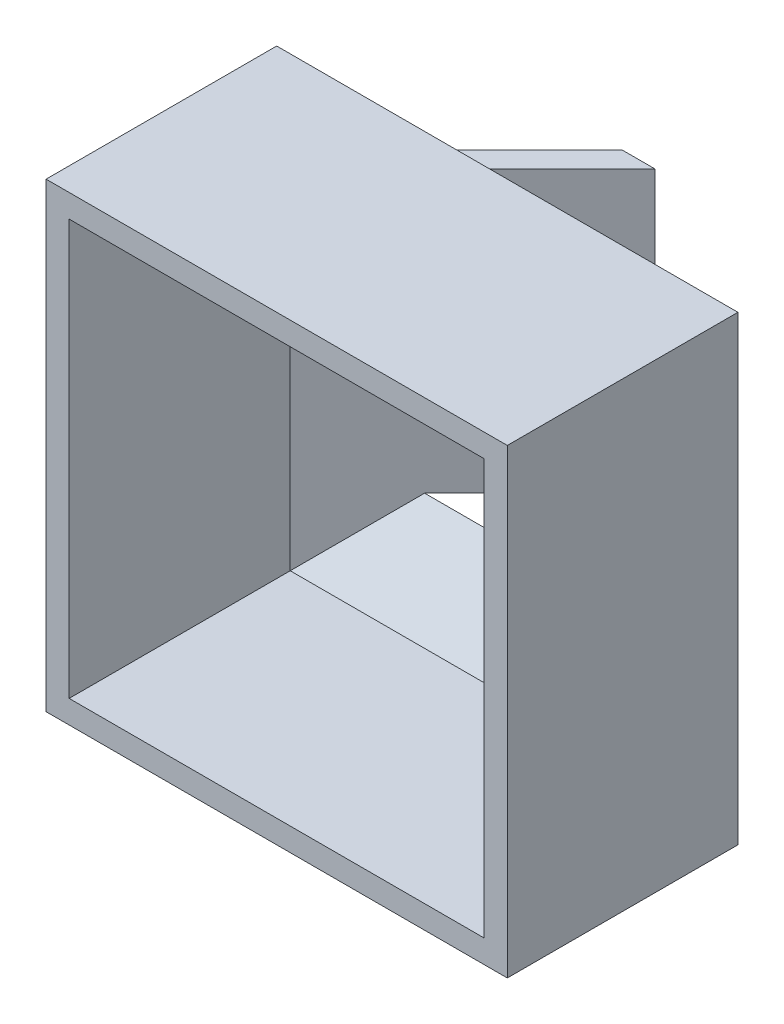
ISO-10303-21;
HEADER;
FILE_DESCRIPTION(('STEP AP214'),'2;1');
FILE_NAME('part.step','',(''),(''),'','','');
FILE_SCHEMA(('AUTOMOTIVE_DESIGN { 1 0 10303 214 1 1 1 1 }'));
ENDSEC;
DATA;
#1=APPLICATION_CONTEXT('core data for automotive mechanical design processes');
#2=APPLICATION_PROTOCOL_DEFINITION('international standard','automotive_design',2000,#1);
#3=PRODUCT_CONTEXT('',#1,'mechanical');
#4=PRODUCT('Part','Part','',(#3));
#5=PRODUCT_RELATED_PRODUCT_CATEGORY('part','',(#4));
#6=PRODUCT_DEFINITION_FORMATION('','',#4);
#7=PRODUCT_DEFINITION_CONTEXT('part definition',#1,'design');
#8=PRODUCT_DEFINITION('design','',#6,#7);
#9=PRODUCT_DEFINITION_SHAPE('','',#8);
#10=(LENGTH_UNIT() NAMED_UNIT(*) SI_UNIT(.MILLI.,.METRE.));
#11=(NAMED_UNIT(*) PLANE_ANGLE_UNIT() SI_UNIT($,.RADIAN.));
#12=(NAMED_UNIT(*) SI_UNIT($,.STERADIAN.) SOLID_ANGLE_UNIT());
#13=UNCERTAINTY_MEASURE_WITH_UNIT(LENGTH_MEASURE(1.E-05),#10,'distance_accuracy_value','');
#14=(GEOMETRIC_REPRESENTATION_CONTEXT(3) GLOBAL_UNCERTAINTY_ASSIGNED_CONTEXT((#13)) GLOBAL_UNIT_ASSIGNED_CONTEXT((#10,
#11,#12)) REPRESENTATION_CONTEXT('',''));
#15=CARTESIAN_POINT('',(0.,0.,0.));
#16=DIRECTION('',(0.,0.,1.));
#17=DIRECTION('',(1.,0.,0.));
#18=AXIS2_PLACEMENT_3D('',#15,#16,#17);
#19=CARTESIAN_POINT('',(0.,0.,0.));
#20=DIRECTION('',(0.,0.,1.));
#21=DIRECTION('',(1.,0.,0.));
#22=AXIS2_PLACEMENT_3D('',#19,#20,#21);
#23=PLANE('',#22);
#24=DIRECTION('',(1.,0.,0.));
#25=VECTOR('',#24,1.);
#26=CARTESIAN_POINT('',(5.00000000000003,-7.82842712474622,0.));
#27=LINE('',#26,#25);
#28=CARTESIAN_POINT('',(5.00000000000003,-7.82842712474622,0.));
#29=VERTEX_POINT('',#28);
#30=CARTESIAN_POINT('',(7.82842712474622,-7.82842712474622,0.));
#31=VERTEX_POINT('',#30);
#32=EDGE_CURVE('E154',#29,#31,#27,.T.);
#33=ORIENTED_EDGE('',*,*,#32,.F.);
#34=DIRECTION('',(0.,1.,0.));
#35=VECTOR('',#34,1.);
#36=CARTESIAN_POINT('',(5.00000000000003,0.,0.));
#37=LINE('',#36,#35);
#38=CARTESIAN_POINT('',(5.00000000000003,-5.00000000000002,0.));
#39=VERTEX_POINT('',#38);
#40=EDGE_CURVE('E164',#29,#39,#37,.T.);
#41=ORIENTED_EDGE('',*,*,#40,.T.);
#42=DIRECTION('',(1.,0.,0.));
#43=VECTOR('',#42,1.);
#44=CARTESIAN_POINT('',(0.,-5.00000000000002,0.));
#45=LINE('',#44,#43);
#46=CARTESIAN_POINT('',(35.,-5.00000000000002,0.));
#47=VERTEX_POINT('',#46);
#48=EDGE_CURVE('E50',#39,#47,#45,.T.);
#49=ORIENTED_EDGE('',*,*,#48,.T.);
#50=DIRECTION('',(0.,-1.,0.));
#51=VECTOR('',#50,1.);
#52=CARTESIAN_POINT('',(35.,0.,0.));
#53=LINE('',#52,#51);
#54=CARTESIAN_POINT('',(35.,-35.,0.));
#55=VERTEX_POINT('',#54);
#56=EDGE_CURVE('E186',#47,#55,#53,.T.);
#57=ORIENTED_EDGE('',*,*,#56,.T.);
#58=DIRECTION('',(-1.,0.,0.));
#59=VECTOR('',#58,1.);
#60=CARTESIAN_POINT('',(0.,-35.,0.));
#61=LINE('',#60,#59);
#62=CARTESIAN_POINT('',(5.00000000000003,-35.,0.));
#63=VERTEX_POINT('',#62);
#64=EDGE_CURVE('E194',#55,#63,#61,.T.);
#65=ORIENTED_EDGE('',*,*,#64,.T.);
#66=CARTESIAN_POINT('',(5.00000000000003,-32.1715728752538,0.));
#67=VERTEX_POINT('',#66);
#68=EDGE_CURVE('E174',#63,#67,#37,.T.);
#69=ORIENTED_EDGE('',*,*,#68,.T.);
#70=DIRECTION('',(1.,0.,0.));
#71=VECTOR('',#70,1.);
#72=CARTESIAN_POINT('',(5.00000000000003,-32.1715728752538,0.));
#73=LINE('',#72,#71);
#74=CARTESIAN_POINT('',(7.82842712474622,-32.1715728752538,0.));
#75=VERTEX_POINT('',#74);
#76=EDGE_CURVE('E168',#67,#75,#73,.T.);
#77=ORIENTED_EDGE('',*,*,#76,.T.);
#78=DIRECTION('',(1.,0.,0.));
#79=VECTOR('',#78,1.);
#80=CARTESIAN_POINT('',(0.,-32.1715728752538,0.));
#81=LINE('',#80,#79);
#82=CARTESIAN_POINT('',(32.1715728752538,-32.1715728752538,0.));
#83=VERTEX_POINT('',#82);
#84=EDGE_CURVE('E250',#83,#75,#81,.F.);
#85=ORIENTED_EDGE('',*,*,#84,.F.);
#86=DIRECTION('',(0.,1.,0.));
#87=VECTOR('',#86,1.);
#88=CARTESIAN_POINT('',(32.1715728752538,0.,0.));
#89=LINE('',#88,#87);
#90=CARTESIAN_POINT('',(32.1715728752538,-7.82842712474622,0.));
#91=VERTEX_POINT('',#90);
#92=EDGE_CURVE('E253',#91,#83,#89,.F.);
#93=ORIENTED_EDGE('',*,*,#92,.F.);
#94=DIRECTION('',(-1.,0.,0.));
#95=VECTOR('',#94,1.);
#96=CARTESIAN_POINT('',(0.,-7.82842712474622,0.));
#97=LINE('',#96,#95);
#98=EDGE_CURVE('E167',#31,#91,#97,.F.);
#99=ORIENTED_EDGE('',*,*,#98,.F.);
#100=EDGE_LOOP('',(#33,#41,#49,#57,#65,#69,#77,#85,#93,#99));
#101=FACE_BOUND('',#100,.T.);
#102=ADVANCED_FACE('F41',(#101),#23,.F.);
#103=CARTESIAN_POINT('',(0.,0.,25.));
#104=DIRECTION('',(1.,0.,0.));
#105=DIRECTION('',(0.,1.,0.));
#106=AXIS2_PLACEMENT_3D('',#103,#104,#105);
#107=PLANE('',#106);
#108=DIRECTION('',(0.,0.,-1.));
#109=VECTOR('',#108,1.);
#110=CARTESIAN_POINT('',(0.,0.,25.));
#111=LINE('',#110,#109);
#112=CARTESIAN_POINT('',(0.,0.,25.));
#113=VERTEX_POINT('',#112);
#114=CARTESIAN_POINT('',(0.,0.,5.00000000000001));
#115=VERTEX_POINT('',#114);
#116=EDGE_CURVE('E215',#113,#115,#111,.T.);
#117=ORIENTED_EDGE('',*,*,#116,.T.);
#118=DIRECTION('',(0.,-1.,0.));
#119=VECTOR('',#118,1.);
#120=CARTESIAN_POINT('',(0.,0.,5.00000000000001));
#121=LINE('',#120,#119);
#122=CARTESIAN_POINT('',(0.,-40.,5.00000000000001));
#123=VERTEX_POINT('',#122);
#124=EDGE_CURVE('E175',#115,#123,#121,.T.);
#125=ORIENTED_EDGE('',*,*,#124,.T.);
#126=DIRECTION('',(0.,0.,-1.));
#127=VECTOR('',#126,1.);
#128=CARTESIAN_POINT('',(0.,-40.,25.));
#129=LINE('',#128,#127);
#130=CARTESIAN_POINT('',(0.,-40.,25.));
#131=VERTEX_POINT('',#130);
#132=EDGE_CURVE('E180',#131,#123,#129,.T.);
#133=ORIENTED_EDGE('',*,*,#132,.F.);
#134=DIRECTION('',(0.,-1.,0.));
#135=VECTOR('',#134,1.);
#136=CARTESIAN_POINT('',(0.,0.,25.));
#137=LINE('',#136,#135);
#138=EDGE_CURVE('E224',#113,#131,#137,.T.);
#139=ORIENTED_EDGE('',*,*,#138,.F.);
#140=EDGE_LOOP('',(#117,#125,#133,#139));
#141=FACE_BOUND('',#140,.T.);
#142=ADVANCED_FACE('F220',(#141),#107,.F.);
#143=CARTESIAN_POINT('',(0.,-40.,25.));
#144=DIRECTION('',(0.,1.,0.));
#145=DIRECTION('',(0.,0.,1.));
#146=AXIS2_PLACEMENT_3D('',#143,#144,#145);
#147=PLANE('',#146);
#148=ORIENTED_EDGE('',*,*,#132,.T.);
#149=DIRECTION('',(1.,0.,0.));
#150=VECTOR('',#149,1.);
#151=CARTESIAN_POINT('',(0.,-40.,5.));
#152=LINE('',#151,#150);
#153=CARTESIAN_POINT('',(40.,-40.,5.));
#154=VERTEX_POINT('',#153);
#155=EDGE_CURVE('E188',#123,#154,#152,.T.);
#156=ORIENTED_EDGE('',*,*,#155,.T.);
#157=DIRECTION('',(0.,0.,-1.));
#158=VECTOR('',#157,1.);
#159=CARTESIAN_POINT('',(40.,-40.,25.));
#160=LINE('',#159,#158);
#161=CARTESIAN_POINT('',(40.,-40.,25.));
#162=VERTEX_POINT('',#161);
#163=EDGE_CURVE('E236',#162,#154,#160,.T.);
#164=ORIENTED_EDGE('',*,*,#163,.F.);
#165=DIRECTION('',(1.,0.,0.));
#166=VECTOR('',#165,1.);
#167=CARTESIAN_POINT('',(0.,-40.,25.));
#168=LINE('',#167,#166);
#169=EDGE_CURVE('E246',#131,#162,#168,.T.);
#170=ORIENTED_EDGE('',*,*,#169,.F.);
#171=EDGE_LOOP('',(#148,#156,#164,#170));
#172=FACE_BOUND('',#171,.T.);
#173=ADVANCED_FACE('F235',(#172),#147,.F.);
#174=CARTESIAN_POINT('',(40.,0.,25.));
#175=DIRECTION('',(-1.,0.,0.));
#176=DIRECTION('',(0.,-1.,0.));
#177=AXIS2_PLACEMENT_3D('',#174,#175,#176);
#178=PLANE('',#177);
#179=ORIENTED_EDGE('',*,*,#163,.T.);
#180=DIRECTION('',(0.,1.,0.));
#181=VECTOR('',#180,1.);
#182=CARTESIAN_POINT('',(40.,0.,5.));
#183=LINE('',#182,#181);
#184=CARTESIAN_POINT('',(40.,0.,5.));
#185=VERTEX_POINT('',#184);
#186=EDGE_CURVE('E178',#154,#185,#183,.T.);
#187=ORIENTED_EDGE('',*,*,#186,.T.);
#188=DIRECTION('',(0.,0.,-1.));
#189=VECTOR('',#188,1.);
#190=CARTESIAN_POINT('',(40.,0.,25.));
#191=LINE('',#190,#189);
#192=CARTESIAN_POINT('',(40.,0.,25.));
#193=VERTEX_POINT('',#192);
#194=EDGE_CURVE('E218',#193,#185,#191,.T.);
#195=ORIENTED_EDGE('',*,*,#194,.F.);
#196=DIRECTION('',(0.,1.,0.));
#197=VECTOR('',#196,1.);
#198=CARTESIAN_POINT('',(40.,0.,25.));
#199=LINE('',#198,#197);
#200=EDGE_CURVE('E240',#162,#193,#199,.T.);
#201=ORIENTED_EDGE('',*,*,#200,.F.);
#202=EDGE_LOOP('',(#179,#187,#195,#201));
#203=FACE_BOUND('',#202,.T.);
#204=ADVANCED_FACE('F239',(#203),#178,.F.);
#205=CARTESIAN_POINT('',(0.,0.,25.));
#206=DIRECTION('',(0.,-1.,0.));
#207=DIRECTION('',(0.,0.,-1.));
#208=AXIS2_PLACEMENT_3D('',#205,#206,#207);
#209=PLANE('',#208);
#210=ORIENTED_EDGE('',*,*,#194,.T.);
#211=DIRECTION('',(-1.,0.,0.));
#212=VECTOR('',#211,1.);
#213=CARTESIAN_POINT('',(0.,0.,5.));
#214=LINE('',#213,#212);
#215=EDGE_CURVE('E198',#185,#115,#214,.T.);
#216=ORIENTED_EDGE('',*,*,#215,.T.);
#217=ORIENTED_EDGE('',*,*,#116,.F.);
#218=DIRECTION('',(-1.,0.,0.));
#219=VECTOR('',#218,1.);
#220=CARTESIAN_POINT('',(0.,0.,25.));
#221=LINE('',#220,#219);
#222=EDGE_CURVE('E225',#193,#113,#221,.T.);
#223=ORIENTED_EDGE('',*,*,#222,.F.);
#224=EDGE_LOOP('',(#210,#216,#217,#223));
#225=FACE_BOUND('',#224,.T.);
#226=ADVANCED_FACE('F213',(#225),#209,.F.);
#227=CARTESIAN_POINT('',(0.,0.,25.));
#228=DIRECTION('',(0.,0.,1.));
#229=DIRECTION('',(1.,0.,0.));
#230=AXIS2_PLACEMENT_3D('',#227,#228,#229);
#231=PLANE('',#230);
#232=DIRECTION('',(0.,-1.,0.));
#233=VECTOR('',#232,1.);
#234=CARTESIAN_POINT('',(2.,0.,25.));
#235=LINE('',#234,#233);
#236=CARTESIAN_POINT('',(2.,-2.,25.));
#237=VERTEX_POINT('',#236);
#238=CARTESIAN_POINT('',(2.,-38.,25.));
#239=VERTEX_POINT('',#238);
#240=EDGE_CURVE('E266',#237,#239,#235,.T.);
#241=ORIENTED_EDGE('',*,*,#240,.F.);
#242=DIRECTION('',(-1.,0.,0.));
#243=VECTOR('',#242,1.);
#244=CARTESIAN_POINT('',(0.,-2.,25.));
#245=LINE('',#244,#243);
#246=CARTESIAN_POINT('',(38.,-2.,25.));
#247=VERTEX_POINT('',#246);
#248=EDGE_CURVE('E259',#247,#237,#245,.T.);
#249=ORIENTED_EDGE('',*,*,#248,.F.);
#250=DIRECTION('',(0.,1.,0.));
#251=VECTOR('',#250,1.);
#252=CARTESIAN_POINT('',(38.,0.,25.));
#253=LINE('',#252,#251);
#254=CARTESIAN_POINT('',(38.,-38.,25.));
#255=VERTEX_POINT('',#254);
#256=EDGE_CURVE('E262',#255,#247,#253,.T.);
#257=ORIENTED_EDGE('',*,*,#256,.F.);
#258=DIRECTION('',(1.,0.,0.));
#259=VECTOR('',#258,1.);
#260=CARTESIAN_POINT('',(0.,-38.,25.));
#261=LINE('',#260,#259);
#262=EDGE_CURVE('E264',#239,#255,#261,.T.);
#263=ORIENTED_EDGE('',*,*,#262,.F.);
#264=EDGE_LOOP('',(#241,#249,#257,#263));
#265=FACE_BOUND('',#264,.T.);
#266=ORIENTED_EDGE('',*,*,#138,.T.);
#267=ORIENTED_EDGE('',*,*,#169,.T.);
#268=ORIENTED_EDGE('',*,*,#200,.T.);
#269=ORIENTED_EDGE('',*,*,#222,.T.);
#270=EDGE_LOOP('',(#266,#267,#268,#269));
#271=FACE_BOUND('',#270,.T.);
#272=ADVANCED_FACE('F341',(#265,#271),#231,.T.);
#273=CARTESIAN_POINT('',(0.,0.,5.00000000000001));
#274=DIRECTION('',(0.707106781186547,0.,0.707106781186549));
#275=DIRECTION('',(0.,-1.,0.));
#276=AXIS2_PLACEMENT_3D('',#273,#274,#275);
#277=PLANE('',#276);
#278=ORIENTED_EDGE('',*,*,#124,.F.);
#279=DIRECTION('',(0.577350269189626,-0.577350269189627,-0.577350269189624));
#280=VECTOR('',#279,1.);
#281=CARTESIAN_POINT('',(0.,0.,5.00000000000001));
#282=LINE('',#281,#280);
#283=EDGE_CURVE('E172',#115,#39,#282,.T.);
#284=ORIENTED_EDGE('',*,*,#283,.T.);
#285=ORIENTED_EDGE('',*,*,#40,.F.);
#286=DIRECTION('',(0.707106781186547,0.,-0.707106781186548));
#287=VECTOR('',#286,1.);
#288=CARTESIAN_POINT('',(5.00000000000003,-7.82842712474622,0.));
#289=LINE('',#288,#287);
#290=CARTESIAN_POINT('',(15.,-7.82842712474622,-10.));
#291=VERTEX_POINT('',#290);
#292=EDGE_CURVE('E150',#29,#291,#289,.T.);
#293=ORIENTED_EDGE('',*,*,#292,.T.);
#294=DIRECTION('',(0.,1.,0.));
#295=VECTOR('',#294,1.);
#296=CARTESIAN_POINT('',(15.,-40.,-10.));
#297=LINE('',#296,#295);
#298=CARTESIAN_POINT('',(15.,-32.1715728752538,-10.));
#299=VERTEX_POINT('',#298);
#300=EDGE_CURVE('E160',#299,#291,#297,.T.);
#301=ORIENTED_EDGE('',*,*,#300,.F.);
#302=DIRECTION('',(0.707106781186547,0.,-0.707106781186548));
#303=VECTOR('',#302,1.);
#304=CARTESIAN_POINT('',(10.,-32.1715728752538,-5.00000000000001));
#305=LINE('',#304,#303);
#306=EDGE_CURVE('E301',#67,#299,#305,.T.);
#307=ORIENTED_EDGE('',*,*,#306,.F.);
#308=ORIENTED_EDGE('',*,*,#68,.F.);
#309=DIRECTION('',(-0.577350269189626,-0.577350269189627,0.577350269189625));
#310=VECTOR('',#309,1.);
#311=CARTESIAN_POINT('',(13.3333333333334,-26.6666666666666,-8.33333333333332));
#312=LINE('',#311,#310);
#313=EDGE_CURVE('E196',#63,#123,#312,.T.);
#314=ORIENTED_EDGE('',*,*,#313,.T.);
#315=EDGE_LOOP('',(#278,#284,#285,#293,#301,#307,#308,#314));
#316=FACE_BOUND('',#315,.T.);
#317=ADVANCED_FACE('F171',(#316),#277,.F.);
#318=CARTESIAN_POINT('',(40.,0.,5.));
#319=DIRECTION('',(-0.707106781186546,0.,0.707106781186548));
#320=DIRECTION('',(0.,1.,0.));
#321=AXIS2_PLACEMENT_3D('',#318,#319,#320);
#322=PLANE('',#321);
#323=ORIENTED_EDGE('',*,*,#56,.F.);
#324=DIRECTION('',(0.577350269189626,0.577350269189627,0.577350269189624));
#325=VECTOR('',#324,1.);
#326=CARTESIAN_POINT('',(40.,0.,5.));
#327=LINE('',#326,#325);
#328=EDGE_CURVE('E11',#47,#185,#327,.T.);
#329=ORIENTED_EDGE('',*,*,#328,.T.);
#330=ORIENTED_EDGE('',*,*,#186,.F.);
#331=DIRECTION('',(-0.577350269189626,0.577350269189627,-0.577350269189624));
#332=VECTOR('',#331,1.);
#333=CARTESIAN_POINT('',(26.6666666666666,-26.6666666666666,-8.33333333333333));
#334=LINE('',#333,#332);
#335=EDGE_CURVE('E191',#154,#55,#334,.T.);
#336=ORIENTED_EDGE('',*,*,#335,.T.);
#337=EDGE_LOOP('',(#323,#329,#330,#336));
#338=FACE_BOUND('',#337,.T.);
#339=ADVANCED_FACE('F205',(#338),#322,.F.);
#340=CARTESIAN_POINT('',(0.,-40.,5.));
#341=DIRECTION('',(0.,0.707106781186546,0.707106781186549));
#342=DIRECTION('',(1.,0.,0.));
#343=AXIS2_PLACEMENT_3D('',#340,#341,#342);
#344=PLANE('',#343);
#345=ORIENTED_EDGE('',*,*,#313,.F.);
#346=ORIENTED_EDGE('',*,*,#64,.F.);
#347=ORIENTED_EDGE('',*,*,#335,.F.);
#348=ORIENTED_EDGE('',*,*,#155,.F.);
#349=EDGE_LOOP('',(#345,#346,#347,#348));
#350=FACE_BOUND('',#349,.T.);
#351=ADVANCED_FACE('F231',(#350),#344,.F.);
#352=CARTESIAN_POINT('',(0.,0.,5.));
#353=DIRECTION('',(0.,-0.707106781186546,0.707106781186549));
#354=DIRECTION('',(-1.,0.,0.));
#355=AXIS2_PLACEMENT_3D('',#352,#353,#354);
#356=PLANE('',#355);
#357=ORIENTED_EDGE('',*,*,#328,.F.);
#358=ORIENTED_EDGE('',*,*,#48,.F.);
#359=ORIENTED_EDGE('',*,*,#283,.F.);
#360=ORIENTED_EDGE('',*,*,#215,.F.);
#361=EDGE_LOOP('',(#357,#358,#359,#360));
#362=FACE_BOUND('',#361,.T.);
#363=ADVANCED_FACE('F44',(#362),#356,.F.);
#364=CARTESIAN_POINT('',(2.,0.,25.));
#365=DIRECTION('',(1.,0.,0.));
#366=DIRECTION('',(0.,1.,0.));
#367=AXIS2_PLACEMENT_3D('',#364,#365,#366);
#368=PLANE('',#367);
#369=DIRECTION('',(0.,0.,-1.));
#370=VECTOR('',#369,1.);
#371=CARTESIAN_POINT('',(2.,-2.,25.));
#372=LINE('',#371,#370);
#373=CARTESIAN_POINT('',(2.00000000000001,-1.99999999999999,5.8284271247462));
#374=VERTEX_POINT('',#373);
#375=EDGE_CURVE('E261',#237,#374,#372,.T.);
#376=ORIENTED_EDGE('',*,*,#375,.F.);
#377=ORIENTED_EDGE('',*,*,#240,.T.);
#378=DIRECTION('',(0.,0.,-1.));
#379=VECTOR('',#378,1.);
#380=CARTESIAN_POINT('',(2.,-38.,25.));
#381=LINE('',#380,#379);
#382=CARTESIAN_POINT('',(2.00000000000001,-38.,5.8284271247462));
#383=VERTEX_POINT('',#382);
#384=EDGE_CURVE('E283',#239,#383,#381,.T.);
#385=ORIENTED_EDGE('',*,*,#384,.T.);
#386=DIRECTION('',(0.,1.,0.));
#387=VECTOR('',#386,1.);
#388=CARTESIAN_POINT('',(2.,0.,5.8284271247462));
#389=LINE('',#388,#387);
#390=EDGE_CURVE('E280',#374,#383,#389,.F.);
#391=ORIENTED_EDGE('',*,*,#390,.F.);
#392=EDGE_LOOP('',(#376,#377,#385,#391));
#393=FACE_BOUND('',#392,.T.);
#394=ADVANCED_FACE('F323',(#393),#368,.T.);
#395=CARTESIAN_POINT('',(0.,-38.,25.));
#396=DIRECTION('',(0.,1.,0.));
#397=DIRECTION('',(0.,0.,1.));
#398=AXIS2_PLACEMENT_3D('',#395,#396,#397);
#399=PLANE('',#398);
#400=ORIENTED_EDGE('',*,*,#384,.F.);
#401=ORIENTED_EDGE('',*,*,#262,.T.);
#402=DIRECTION('',(0.,0.,-1.));
#403=VECTOR('',#402,1.);
#404=CARTESIAN_POINT('',(38.,-38.,25.));
#405=LINE('',#404,#403);
#406=CARTESIAN_POINT('',(38.,-38.,5.82842712474618));
#407=VERTEX_POINT('',#406);
#408=EDGE_CURVE('E277',#255,#407,#405,.T.);
#409=ORIENTED_EDGE('',*,*,#408,.T.);
#410=DIRECTION('',(-1.,0.,0.));
#411=VECTOR('',#410,1.);
#412=CARTESIAN_POINT('',(0.,-38.,5.82842712474619));
#413=LINE('',#412,#411);
#414=EDGE_CURVE('E255',#383,#407,#413,.F.);
#415=ORIENTED_EDGE('',*,*,#414,.F.);
#416=EDGE_LOOP('',(#400,#401,#409,#415));
#417=FACE_BOUND('',#416,.T.);
#418=ADVANCED_FACE('F327',(#417),#399,.T.);
#419=CARTESIAN_POINT('',(38.,0.,25.));
#420=DIRECTION('',(-1.,0.,0.));
#421=DIRECTION('',(0.,-1.,0.));
#422=AXIS2_PLACEMENT_3D('',#419,#420,#421);
#423=PLANE('',#422);
#424=ORIENTED_EDGE('',*,*,#408,.F.);
#425=ORIENTED_EDGE('',*,*,#256,.T.);
#426=DIRECTION('',(0.,0.,-1.));
#427=VECTOR('',#426,1.);
#428=CARTESIAN_POINT('',(38.,-2.,25.));
#429=LINE('',#428,#427);
#430=CARTESIAN_POINT('',(38.,-2.,5.82842712474619));
#431=VERTEX_POINT('',#430);
#432=EDGE_CURVE('E57',#247,#431,#429,.T.);
#433=ORIENTED_EDGE('',*,*,#432,.T.);
#434=DIRECTION('',(0.,-1.,0.));
#435=VECTOR('',#434,1.);
#436=CARTESIAN_POINT('',(38.,0.,5.82842712474618));
#437=LINE('',#436,#435);
#438=EDGE_CURVE('E256',#407,#431,#437,.F.);
#439=ORIENTED_EDGE('',*,*,#438,.F.);
#440=EDGE_LOOP('',(#424,#425,#433,#439));
#441=FACE_BOUND('',#440,.T.);
#442=ADVANCED_FACE('F332',(#441),#423,.T.);
#443=CARTESIAN_POINT('',(0.,-2.,25.));
#444=DIRECTION('',(0.,-1.,0.));
#445=DIRECTION('',(0.,0.,-1.));
#446=AXIS2_PLACEMENT_3D('',#443,#444,#445);
#447=PLANE('',#446);
#448=ORIENTED_EDGE('',*,*,#432,.F.);
#449=ORIENTED_EDGE('',*,*,#248,.T.);
#450=ORIENTED_EDGE('',*,*,#375,.T.);
#451=DIRECTION('',(1.,0.,0.));
#452=VECTOR('',#451,1.);
#453=CARTESIAN_POINT('',(0.,-2.,5.82842712474619));
#454=LINE('',#453,#452);
#455=EDGE_CURVE('E272',#431,#374,#454,.F.);
#456=ORIENTED_EDGE('',*,*,#455,.F.);
#457=EDGE_LOOP('',(#448,#449,#450,#456));
#458=FACE_BOUND('',#457,.T.);
#459=ADVANCED_FACE('F338',(#458),#447,.T.);
#460=CARTESIAN_POINT('',(1.41421356237309,0.,6.41421356237311));
#461=DIRECTION('',(0.707106781186547,0.,0.707106781186549));
#462=DIRECTION('',(0.,-1.,0.));
#463=AXIS2_PLACEMENT_3D('',#460,#461,#462);
#464=PLANE('',#463);
#465=ORIENTED_EDGE('',*,*,#390,.T.);
#466=DIRECTION('',(-0.577350269189626,-0.577350269189627,0.577350269189625));
#467=VECTOR('',#466,1.);
#468=CARTESIAN_POINT('',(14.2761423749154,-25.7238576250846,-6.44771525016919));
#469=LINE('',#468,#467);
#470=EDGE_CURVE('E252',#75,#383,#469,.T.);
#471=ORIENTED_EDGE('',*,*,#470,.F.);
#472=DIRECTION('',(-0.707106781186547,0.,0.707106781186548));
#473=VECTOR('',#472,1.);
#474=CARTESIAN_POINT('',(17.8284271247462,-32.1715728752538,-10.));
#475=LINE('',#474,#473);
#476=CARTESIAN_POINT('',(17.8284271247462,-32.1715728752538,-10.));
#477=VERTEX_POINT('',#476);
#478=EDGE_CURVE('E298',#477,#75,#475,.T.);
#479=ORIENTED_EDGE('',*,*,#478,.F.);
#480=DIRECTION('',(0.,-1.,0.));
#481=VECTOR('',#480,1.);
#482=CARTESIAN_POINT('',(17.8284271247462,-7.82842712474622,-10.));
#483=LINE('',#482,#481);
#484=CARTESIAN_POINT('',(17.8284271247462,-7.82842712474622,-10.));
#485=VERTEX_POINT('',#484);
#486=EDGE_CURVE('E295',#485,#477,#483,.T.);
#487=ORIENTED_EDGE('',*,*,#486,.F.);
#488=DIRECTION('',(-0.707106781186547,0.,0.707106781186548));
#489=VECTOR('',#488,1.);
#490=CARTESIAN_POINT('',(17.8284271247462,-7.82842712474622,-10.));
#491=LINE('',#490,#489);
#492=EDGE_CURVE('E299',#485,#31,#491,.T.);
#493=ORIENTED_EDGE('',*,*,#492,.T.);
#494=DIRECTION('',(0.577350269189626,-0.577350269189627,-0.577350269189624));
#495=VECTOR('',#494,1.);
#496=CARTESIAN_POINT('',(0.942809041582066,-0.942809041582051,6.88561808316414));
#497=LINE('',#496,#495);
#498=EDGE_CURVE('E258',#374,#31,#497,.T.);
#499=ORIENTED_EDGE('',*,*,#498,.F.);
#500=EDGE_LOOP('',(#465,#471,#479,#487,#493,#499));
#501=FACE_BOUND('',#500,.T.);
#502=ADVANCED_FACE('F317',(#501),#464,.T.);
#503=CARTESIAN_POINT('',(38.5857864376269,0.,6.41421356237309));
#504=DIRECTION('',(-0.707106781186546,0.,0.707106781186548));
#505=DIRECTION('',(0.,1.,0.));
#506=AXIS2_PLACEMENT_3D('',#503,#504,#505);
#507=PLANE('',#506);
#508=ORIENTED_EDGE('',*,*,#92,.T.);
#509=DIRECTION('',(-0.577350269189626,0.577350269189627,-0.577350269189624));
#510=VECTOR('',#509,1.);
#511=CARTESIAN_POINT('',(25.7238576250846,-25.7238576250846,-6.4477152501692));
#512=LINE('',#511,#510);
#513=EDGE_CURVE('E65',#407,#83,#512,.T.);
#514=ORIENTED_EDGE('',*,*,#513,.F.);
#515=ORIENTED_EDGE('',*,*,#438,.T.);
#516=DIRECTION('',(0.577350269189626,0.577350269189627,0.577350269189624));
#517=VECTOR('',#516,1.);
#518=CARTESIAN_POINT('',(39.0571909584179,-0.94280904158206,6.88561808316413));
#519=LINE('',#518,#517);
#520=EDGE_CURVE('E249',#91,#431,#519,.T.);
#521=ORIENTED_EDGE('',*,*,#520,.F.);
#522=EDGE_LOOP('',(#508,#514,#515,#521));
#523=FACE_BOUND('',#522,.T.);
#524=ADVANCED_FACE('F335',(#523),#507,.T.);
#525=CARTESIAN_POINT('',(0.,-38.5857864376269,6.41421356237309));
#526=DIRECTION('',(0.,0.707106781186546,0.707106781186549));
#527=DIRECTION('',(1.,0.,0.));
#528=AXIS2_PLACEMENT_3D('',#525,#526,#527);
#529=PLANE('',#528);
#530=ORIENTED_EDGE('',*,*,#470,.T.);
#531=ORIENTED_EDGE('',*,*,#414,.T.);
#532=ORIENTED_EDGE('',*,*,#513,.T.);
#533=ORIENTED_EDGE('',*,*,#84,.T.);
#534=EDGE_LOOP('',(#530,#531,#532,#533));
#535=FACE_BOUND('',#534,.T.);
#536=ADVANCED_FACE('F315',(#535),#529,.T.);
#537=CARTESIAN_POINT('',(0.,-1.41421356237309,6.41421356237309));
#538=DIRECTION('',(0.,-0.707106781186546,0.707106781186549));
#539=DIRECTION('',(-1.,0.,0.));
#540=AXIS2_PLACEMENT_3D('',#537,#538,#539);
#541=PLANE('',#540);
#542=ORIENTED_EDGE('',*,*,#520,.T.);
#543=ORIENTED_EDGE('',*,*,#455,.T.);
#544=ORIENTED_EDGE('',*,*,#498,.T.);
#545=ORIENTED_EDGE('',*,*,#98,.T.);
#546=EDGE_LOOP('',(#542,#543,#544,#545));
#547=FACE_BOUND('',#546,.T.);
#548=ADVANCED_FACE('F337',(#547),#541,.T.);
#549=CARTESIAN_POINT('',(5.00000000000003,-7.82842712474622,-10.));
#550=DIRECTION('',(0.,0.,1.));
#551=DIRECTION('',(1.,0.,0.));
#552=AXIS2_PLACEMENT_3D('',#549,#550,#551);
#553=PLANE('',#552);
#554=DIRECTION('',(1.,0.,0.));
#555=VECTOR('',#554,1.);
#556=CARTESIAN_POINT('',(5.00000000000003,-32.1715728752538,-10.));
#557=LINE('',#556,#555);
#558=EDGE_CURVE('E268',#299,#477,#557,.T.);
#559=ORIENTED_EDGE('',*,*,#558,.F.);
#560=ORIENTED_EDGE('',*,*,#300,.T.);
#561=DIRECTION('',(1.,0.,0.));
#562=VECTOR('',#561,1.);
#563=CARTESIAN_POINT('',(5.00000000000003,-7.82842712474622,-10.));
#564=LINE('',#563,#562);
#565=EDGE_CURVE('E156',#291,#485,#564,.T.);
#566=ORIENTED_EDGE('',*,*,#565,.T.);
#567=ORIENTED_EDGE('',*,*,#486,.T.);
#568=EDGE_LOOP('',(#559,#560,#566,#567));
#569=FACE_BOUND('',#568,.T.);
#570=ADVANCED_FACE('F307',(#569),#553,.F.);
#571=CARTESIAN_POINT('',(5.00000000000003,-32.1715728752538,-10.));
#572=DIRECTION('',(0.,1.,0.));
#573=DIRECTION('',(-1.,0.,0.));
#574=AXIS2_PLACEMENT_3D('',#571,#572,#573);
#575=PLANE('',#574);
#576=ORIENTED_EDGE('',*,*,#76,.F.);
#577=ORIENTED_EDGE('',*,*,#306,.T.);
#578=ORIENTED_EDGE('',*,*,#558,.T.);
#579=ORIENTED_EDGE('',*,*,#478,.T.);
#580=EDGE_LOOP('',(#576,#577,#578,#579));
#581=FACE_BOUND('',#580,.T.);
#582=ADVANCED_FACE('F311',(#581),#575,.F.);
#583=CARTESIAN_POINT('',(5.00000000000003,-7.82842712474622,-10.));
#584=DIRECTION('',(0.,-1.,0.));
#585=DIRECTION('',(1.,0.,0.));
#586=AXIS2_PLACEMENT_3D('',#583,#584,#585);
#587=PLANE('',#586);
#588=ORIENTED_EDGE('',*,*,#565,.F.);
#589=ORIENTED_EDGE('',*,*,#292,.F.);
#590=ORIENTED_EDGE('',*,*,#32,.T.);
#591=ORIENTED_EDGE('',*,*,#492,.F.);
#592=EDGE_LOOP('',(#588,#589,#590,#591));
#593=FACE_BOUND('',#592,.T.);
#594=ADVANCED_FACE('F152',(#593),#587,.F.);
#595=CLOSED_SHELL('',(#102,#142,#173,#204,#226,#272,#317,#339,#351,#363,#394,#418,#442,#459,
#502,#524,#536,#548,#570,#582,#594));
#596=MANIFOLD_SOLID_BREP('B2',#595);
#597=ADVANCED_BREP_SHAPE_REPRESENTATION('',(#18,#596),#14);
#598=SHAPE_DEFINITION_REPRESENTATION(#9,#597);
ENDSEC;
END-ISO-10303-21;
